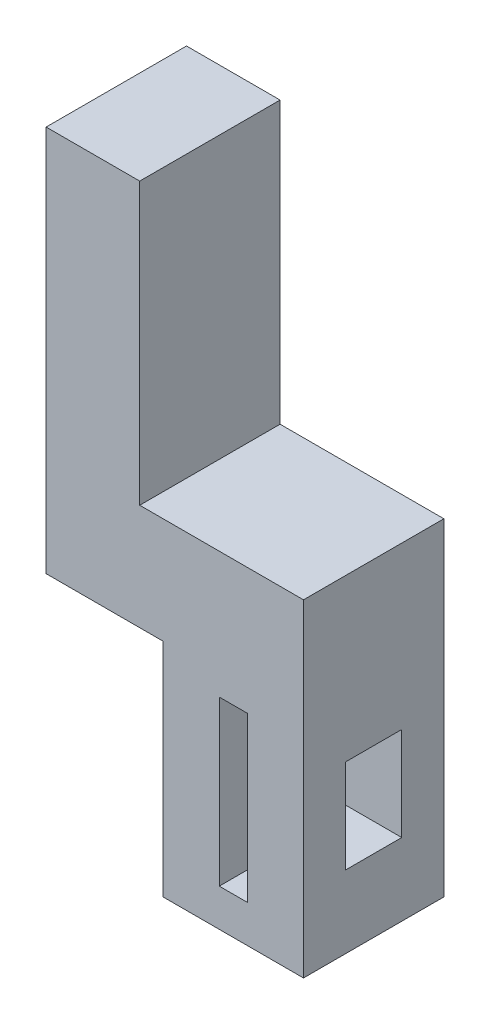
ISO-10303-21;
HEADER;
FILE_DESCRIPTION(('STEP AP214'),'2;1');
FILE_NAME('part.step','',(''),(''),'','','');
FILE_SCHEMA(('AUTOMOTIVE_DESIGN { 1 0 10303 214 1 1 1 1 }'));
ENDSEC;
DATA;
#1=APPLICATION_CONTEXT('core data for automotive mechanical design processes');
#2=APPLICATION_PROTOCOL_DEFINITION('international standard','automotive_design',2000,#1);
#3=PRODUCT_CONTEXT('',#1,'mechanical');
#4=PRODUCT('Part','Part','',(#3));
#5=PRODUCT_RELATED_PRODUCT_CATEGORY('part','',(#4));
#6=PRODUCT_DEFINITION_FORMATION('','',#4);
#7=PRODUCT_DEFINITION_CONTEXT('part definition',#1,'design');
#8=PRODUCT_DEFINITION('design','',#6,#7);
#9=PRODUCT_DEFINITION_SHAPE('','',#8);
#10=(LENGTH_UNIT() NAMED_UNIT(*) SI_UNIT(.MILLI.,.METRE.));
#11=(NAMED_UNIT(*) PLANE_ANGLE_UNIT() SI_UNIT($,.RADIAN.));
#12=(NAMED_UNIT(*) SI_UNIT($,.STERADIAN.) SOLID_ANGLE_UNIT());
#13=UNCERTAINTY_MEASURE_WITH_UNIT(LENGTH_MEASURE(1.E-05),#10,'distance_accuracy_value','');
#14=(GEOMETRIC_REPRESENTATION_CONTEXT(3) GLOBAL_UNCERTAINTY_ASSIGNED_CONTEXT((#13)) GLOBAL_UNIT_ASSIGNED_CONTEXT((#10,
#11,#12)) REPRESENTATION_CONTEXT('',''));
#15=CARTESIAN_POINT('',(0.,0.,0.));
#16=DIRECTION('',(0.,0.,1.));
#17=DIRECTION('',(1.,0.,0.));
#18=AXIS2_PLACEMENT_3D('',#15,#16,#17);
#19=CARTESIAN_POINT('',(0.,70.,0.));
#20=DIRECTION('',(1.,0.,0.));
#21=DIRECTION('',(0.,0.,-1.));
#22=AXIS2_PLACEMENT_3D('',#19,#20,#21);
#23=PLANE('',#22);
#24=DIRECTION('',(0.,0.,1.));
#25=VECTOR('',#24,1.);
#26=CARTESIAN_POINT('',(0.,35.5,21.));
#27=LINE('',#26,#25);
#28=CARTESIAN_POINT('',(0.,35.5,9.00000000000001));
#29=VERTEX_POINT('',#28);
#30=CARTESIAN_POINT('',(0.,35.5,21.));
#31=VERTEX_POINT('',#30);
#32=EDGE_CURVE('E222',#29,#31,#27,.T.);
#33=ORIENTED_EDGE('',*,*,#32,.T.);
#34=DIRECTION('',(0.,-1.,0.));
#35=VECTOR('',#34,1.);
#36=CARTESIAN_POINT('',(0.,35.5,21.));
#37=LINE('',#36,#35);
#38=CARTESIAN_POINT('',(0.,15.5,21.));
#39=VERTEX_POINT('',#38);
#40=EDGE_CURVE('E212',#31,#39,#37,.T.);
#41=ORIENTED_EDGE('',*,*,#40,.T.);
#42=DIRECTION('',(0.,0.,-1.));
#43=VECTOR('',#42,1.);
#44=CARTESIAN_POINT('',(0.,15.5,21.));
#45=LINE('',#44,#43);
#46=CARTESIAN_POINT('',(0.,15.5,9.));
#47=VERTEX_POINT('',#46);
#48=EDGE_CURVE('E215',#39,#47,#45,.T.);
#49=ORIENTED_EDGE('',*,*,#48,.T.);
#50=DIRECTION('',(0.,1.,0.));
#51=VECTOR('',#50,1.);
#52=CARTESIAN_POINT('',(0.,35.5,9.00000000000001));
#53=LINE('',#52,#51);
#54=EDGE_CURVE('E219',#47,#29,#53,.T.);
#55=ORIENTED_EDGE('',*,*,#54,.T.);
#56=EDGE_LOOP('',(#33,#41,#49,#55));
#57=FACE_BOUND('',#56,.T.);
#58=DIRECTION('',(0.,0.,1.));
#59=VECTOR('',#58,1.);
#60=CARTESIAN_POINT('',(0.,47.3303995513235,0.));
#61=LINE('',#60,#59);
#62=CARTESIAN_POINT('',(0.,47.3303995513235,0.));
#63=VERTEX_POINT('',#62);
#64=CARTESIAN_POINT('',(0.,47.3303995513235,30.));
#65=VERTEX_POINT('',#64);
#66=EDGE_CURVE('E55',#63,#65,#61,.T.);
#67=ORIENTED_EDGE('',*,*,#66,.F.);
#68=DIRECTION('',(0.,-1.,0.));
#69=VECTOR('',#68,1.);
#70=CARTESIAN_POINT('',(0.,70.,0.));
#71=LINE('',#70,#69);
#72=CARTESIAN_POINT('',(0.,0.,0.));
#73=VERTEX_POINT('',#72);
#74=EDGE_CURVE('E301',#63,#73,#71,.T.);
#75=ORIENTED_EDGE('',*,*,#74,.T.);
#76=DIRECTION('',(0.,0.,1.));
#77=VECTOR('',#76,1.);
#78=CARTESIAN_POINT('',(0.,0.,0.));
#79=LINE('',#78,#77);
#80=CARTESIAN_POINT('',(0.,0.,30.));
#81=VERTEX_POINT('',#80);
#82=EDGE_CURVE('E287',#73,#81,#79,.T.);
#83=ORIENTED_EDGE('',*,*,#82,.T.);
#84=DIRECTION('',(0.,-1.,0.));
#85=VECTOR('',#84,1.);
#86=CARTESIAN_POINT('',(0.,70.,30.));
#87=LINE('',#86,#85);
#88=EDGE_CURVE('E317',#65,#81,#87,.T.);
#89=ORIENTED_EDGE('',*,*,#88,.F.);
#90=EDGE_LOOP('',(#67,#75,#83,#89));
#91=FACE_BOUND('',#90,.T.);
#92=ADVANCED_FACE('F33',(#57,#91),#23,.F.);
#93=CARTESIAN_POINT('',(0.,70.,30.));
#94=DIRECTION('',(0.,0.,-1.));
#95=DIRECTION('',(-1.,0.,0.));
#96=AXIS2_PLACEMENT_3D('',#93,#94,#95);
#97=PLANE('',#96);
#98=DIRECTION('',(1.,0.,0.));
#99=VECTOR('',#98,1.);
#100=CARTESIAN_POINT('',(12.,8.,30.));
#101=LINE('',#100,#99);
#102=CARTESIAN_POINT('',(12.,8.,30.));
#103=VERTEX_POINT('',#102);
#104=CARTESIAN_POINT('',(18.,8.,30.));
#105=VERTEX_POINT('',#104);
#106=EDGE_CURVE('E277',#103,#105,#101,.T.);
#107=ORIENTED_EDGE('',*,*,#106,.F.);
#108=DIRECTION('',(0.,-1.,0.));
#109=VECTOR('',#108,1.);
#110=CARTESIAN_POINT('',(12.,43.,30.));
#111=LINE('',#110,#109);
#112=CARTESIAN_POINT('',(12.,43.,30.));
#113=VERTEX_POINT('',#112);
#114=EDGE_CURVE('E261',#113,#103,#111,.T.);
#115=ORIENTED_EDGE('',*,*,#114,.F.);
#116=DIRECTION('',(-1.,0.,0.));
#117=VECTOR('',#116,1.);
#118=CARTESIAN_POINT('',(12.,43.,30.));
#119=LINE('',#118,#117);
#120=CARTESIAN_POINT('',(18.,43.,30.));
#121=VERTEX_POINT('',#120);
#122=EDGE_CURVE('E266',#121,#113,#119,.T.);
#123=ORIENTED_EDGE('',*,*,#122,.F.);
#124=DIRECTION('',(0.,1.,0.));
#125=VECTOR('',#124,1.);
#126=CARTESIAN_POINT('',(18.,43.,30.));
#127=LINE('',#126,#125);
#128=EDGE_CURVE('E280',#105,#121,#127,.T.);
#129=ORIENTED_EDGE('',*,*,#128,.F.);
#130=EDGE_LOOP('',(#107,#115,#123,#129));
#131=FACE_BOUND('',#130,.T.);
#132=DIRECTION('',(1.,0.,0.));
#133=VECTOR('',#132,1.);
#134=CARTESIAN_POINT('',(0.,0.,30.));
#135=LINE('',#134,#133);
#136=CARTESIAN_POINT('',(30.,0.,30.));
#137=VERTEX_POINT('',#136);
#138=EDGE_CURVE('E304',#81,#137,#135,.T.);
#139=ORIENTED_EDGE('',*,*,#138,.T.);
#140=DIRECTION('',(0.,-1.,0.));
#141=VECTOR('',#140,1.);
#142=CARTESIAN_POINT('',(30.,70.,30.));
#143=LINE('',#142,#141);
#144=CARTESIAN_POINT('',(30.,70.,30.));
#145=VERTEX_POINT('',#144);
#146=EDGE_CURVE('E314',#145,#137,#143,.T.);
#147=ORIENTED_EDGE('',*,*,#146,.F.);
#148=DIRECTION('',(1.,0.,0.));
#149=VECTOR('',#148,1.);
#150=CARTESIAN_POINT('',(0.,70.,30.));
#151=LINE('',#150,#149);
#152=CARTESIAN_POINT('',(-5.,70.,30.));
#153=VERTEX_POINT('',#152);
#154=EDGE_CURVE('E294',#153,#145,#151,.T.);
#155=ORIENTED_EDGE('',*,*,#154,.F.);
#156=DIRECTION('',(0.,-1.,0.));
#157=VECTOR('',#156,1.);
#158=CARTESIAN_POINT('',(-5.,130.,30.));
#159=LINE('',#158,#157);
#160=CARTESIAN_POINT('',(-5.,130.,30.));
#161=VERTEX_POINT('',#160);
#162=EDGE_CURVE('E185',#161,#153,#159,.T.);
#163=ORIENTED_EDGE('',*,*,#162,.F.);
#164=DIRECTION('',(1.,0.,0.));
#165=VECTOR('',#164,1.);
#166=CARTESIAN_POINT('',(-25.,130.,30.));
#167=LINE('',#166,#165);
#168=CARTESIAN_POINT('',(-25.,130.,30.));
#169=VERTEX_POINT('',#168);
#170=EDGE_CURVE('E182',#169,#161,#167,.T.);
#171=ORIENTED_EDGE('',*,*,#170,.F.);
#172=DIRECTION('',(0.,1.,0.));
#173=VECTOR('',#172,1.);
#174=CARTESIAN_POINT('',(-25.,70.,30.));
#175=LINE('',#174,#173);
#176=CARTESIAN_POINT('',(-25.,47.3303995513235,30.));
#177=VERTEX_POINT('',#176);
#178=EDGE_CURVE('E169',#177,#169,#175,.T.);
#179=ORIENTED_EDGE('',*,*,#178,.F.);
#180=DIRECTION('',(1.,0.,0.));
#181=VECTOR('',#180,1.);
#182=CARTESIAN_POINT('',(-25.,47.3303995513235,30.));
#183=LINE('',#182,#181);
#184=EDGE_CURVE('E179',#177,#65,#183,.T.);
#185=ORIENTED_EDGE('',*,*,#184,.T.);
#186=ORIENTED_EDGE('',*,*,#88,.T.);
#187=EDGE_LOOP('',(#139,#147,#155,#163,#171,#179,#185,#186));
#188=FACE_BOUND('',#187,.T.);
#189=ADVANCED_FACE('F183',(#131,#188),#97,.F.);
#190=CARTESIAN_POINT('',(30.,70.,0.));
#191=DIRECTION('',(-1.,0.,0.));
#192=DIRECTION('',(0.,0.,1.));
#193=AXIS2_PLACEMENT_3D('',#190,#191,#192);
#194=PLANE('',#193);
#195=DIRECTION('',(0.,0.,-1.));
#196=VECTOR('',#195,1.);
#197=CARTESIAN_POINT('',(30.,15.5,21.));
#198=LINE('',#197,#196);
#199=CARTESIAN_POINT('',(30.,15.5,21.));
#200=VERTEX_POINT('',#199);
#201=CARTESIAN_POINT('',(30.,15.5,9.));
#202=VERTEX_POINT('',#201);
#203=EDGE_CURVE('E227',#200,#202,#198,.T.);
#204=ORIENTED_EDGE('',*,*,#203,.F.);
#205=DIRECTION('',(0.,-1.,0.));
#206=VECTOR('',#205,1.);
#207=CARTESIAN_POINT('',(30.,35.5,21.));
#208=LINE('',#207,#206);
#209=CARTESIAN_POINT('',(30.,35.5,21.));
#210=VERTEX_POINT('',#209);
#211=EDGE_CURVE('E211',#210,#200,#208,.T.);
#212=ORIENTED_EDGE('',*,*,#211,.F.);
#213=DIRECTION('',(0.,0.,1.));
#214=VECTOR('',#213,1.);
#215=CARTESIAN_POINT('',(30.,35.5,21.));
#216=LINE('',#215,#214);
#217=CARTESIAN_POINT('',(30.,35.5,9.));
#218=VERTEX_POINT('',#217);
#219=EDGE_CURVE('E216',#218,#210,#216,.T.);
#220=ORIENTED_EDGE('',*,*,#219,.F.);
#221=DIRECTION('',(0.,1.,0.));
#222=VECTOR('',#221,1.);
#223=CARTESIAN_POINT('',(30.,35.5,9.));
#224=LINE('',#223,#222);
#225=EDGE_CURVE('E230',#202,#218,#224,.T.);
#226=ORIENTED_EDGE('',*,*,#225,.F.);
#227=EDGE_LOOP('',(#204,#212,#220,#226));
#228=FACE_BOUND('',#227,.T.);
#229=DIRECTION('',(0.,0.,-1.));
#230=VECTOR('',#229,1.);
#231=CARTESIAN_POINT('',(30.,0.,0.));
#232=LINE('',#231,#230);
#233=CARTESIAN_POINT('',(30.,0.,0.));
#234=VERTEX_POINT('',#233);
#235=EDGE_CURVE('E306',#137,#234,#232,.T.);
#236=ORIENTED_EDGE('',*,*,#235,.T.);
#237=DIRECTION('',(0.,-1.,0.));
#238=VECTOR('',#237,1.);
#239=CARTESIAN_POINT('',(30.,70.,0.));
#240=LINE('',#239,#238);
#241=CARTESIAN_POINT('',(30.,70.,0.));
#242=VERTEX_POINT('',#241);
#243=EDGE_CURVE('E311',#242,#234,#240,.T.);
#244=ORIENTED_EDGE('',*,*,#243,.F.);
#245=DIRECTION('',(0.,0.,-1.));
#246=VECTOR('',#245,1.);
#247=CARTESIAN_POINT('',(30.,70.,0.));
#248=LINE('',#247,#246);
#249=EDGE_CURVE('E296',#145,#242,#248,.T.);
#250=ORIENTED_EDGE('',*,*,#249,.F.);
#251=ORIENTED_EDGE('',*,*,#146,.T.);
#252=EDGE_LOOP('',(#236,#244,#250,#251));
#253=FACE_BOUND('',#252,.T.);
#254=ADVANCED_FACE('F340',(#228,#253),#194,.F.);
#255=CARTESIAN_POINT('',(0.,70.,0.));
#256=DIRECTION('',(0.,0.,1.));
#257=DIRECTION('',(1.,0.,0.));
#258=AXIS2_PLACEMENT_3D('',#255,#256,#257);
#259=PLANE('',#258);
#260=DIRECTION('',(-1.,0.,0.));
#261=VECTOR('',#260,1.);
#262=CARTESIAN_POINT('',(12.,43.,0.));
#263=LINE('',#262,#261);
#264=CARTESIAN_POINT('',(18.,43.,0.));
#265=VERTEX_POINT('',#264);
#266=CARTESIAN_POINT('',(12.,43.,0.));
#267=VERTEX_POINT('',#266);
#268=EDGE_CURVE('E272',#265,#267,#263,.T.);
#269=ORIENTED_EDGE('',*,*,#268,.T.);
#270=DIRECTION('',(0.,-1.,0.));
#271=VECTOR('',#270,1.);
#272=CARTESIAN_POINT('',(12.,43.,0.));
#273=LINE('',#272,#271);
#274=CARTESIAN_POINT('',(12.,8.,0.));
#275=VERTEX_POINT('',#274);
#276=EDGE_CURVE('E262',#267,#275,#273,.T.);
#277=ORIENTED_EDGE('',*,*,#276,.T.);
#278=DIRECTION('',(1.,0.,0.));
#279=VECTOR('',#278,1.);
#280=CARTESIAN_POINT('',(12.,8.,0.));
#281=LINE('',#280,#279);
#282=CARTESIAN_POINT('',(18.,8.,0.));
#283=VERTEX_POINT('',#282);
#284=EDGE_CURVE('E265',#275,#283,#281,.T.);
#285=ORIENTED_EDGE('',*,*,#284,.T.);
#286=DIRECTION('',(0.,1.,0.));
#287=VECTOR('',#286,1.);
#288=CARTESIAN_POINT('',(18.,43.,0.));
#289=LINE('',#288,#287);
#290=EDGE_CURVE('E269',#283,#265,#289,.T.);
#291=ORIENTED_EDGE('',*,*,#290,.T.);
#292=EDGE_LOOP('',(#269,#277,#285,#291));
#293=FACE_BOUND('',#292,.T.);
#294=DIRECTION('',(-1.,0.,0.));
#295=VECTOR('',#294,1.);
#296=CARTESIAN_POINT('',(0.,0.,0.));
#297=LINE('',#296,#295);
#298=EDGE_CURVE('E297',#234,#73,#297,.T.);
#299=ORIENTED_EDGE('',*,*,#298,.T.);
#300=ORIENTED_EDGE('',*,*,#74,.F.);
#301=DIRECTION('',(1.,0.,0.));
#302=VECTOR('',#301,1.);
#303=CARTESIAN_POINT('',(-25.,47.3303995513235,0.));
#304=LINE('',#303,#302);
#305=CARTESIAN_POINT('',(-25.,47.3303995513235,0.));
#306=VERTEX_POINT('',#305);
#307=EDGE_CURVE('E208',#306,#63,#304,.T.);
#308=ORIENTED_EDGE('',*,*,#307,.F.);
#309=DIRECTION('',(0.,-1.,0.));
#310=VECTOR('',#309,1.);
#311=CARTESIAN_POINT('',(-25.,70.,0.));
#312=LINE('',#311,#310);
#313=CARTESIAN_POINT('',(-25.,130.,0.));
#314=VERTEX_POINT('',#313);
#315=EDGE_CURVE('E203',#314,#306,#312,.T.);
#316=ORIENTED_EDGE('',*,*,#315,.F.);
#317=DIRECTION('',(-1.,0.,0.));
#318=VECTOR('',#317,1.);
#319=CARTESIAN_POINT('',(-25.,130.,0.));
#320=LINE('',#319,#318);
#321=CARTESIAN_POINT('',(-5.,130.,0.));
#322=VERTEX_POINT('',#321);
#323=EDGE_CURVE('E193',#322,#314,#320,.T.);
#324=ORIENTED_EDGE('',*,*,#323,.F.);
#325=DIRECTION('',(0.,-1.,0.));
#326=VECTOR('',#325,1.);
#327=CARTESIAN_POINT('',(-5.,130.,0.));
#328=LINE('',#327,#326);
#329=CARTESIAN_POINT('',(-5.,70.,0.));
#330=VERTEX_POINT('',#329);
#331=EDGE_CURVE('E198',#322,#330,#328,.T.);
#332=ORIENTED_EDGE('',*,*,#331,.T.);
#333=DIRECTION('',(-1.,0.,0.));
#334=VECTOR('',#333,1.);
#335=CARTESIAN_POINT('',(0.,70.,0.));
#336=LINE('',#335,#334);
#337=EDGE_CURVE('E299',#242,#330,#336,.T.);
#338=ORIENTED_EDGE('',*,*,#337,.F.);
#339=ORIENTED_EDGE('',*,*,#243,.T.);
#340=EDGE_LOOP('',(#299,#300,#308,#316,#324,#332,#338,#339));
#341=FACE_BOUND('',#340,.T.);
#342=ADVANCED_FACE('F396',(#293,#341),#259,.F.);
#343=CARTESIAN_POINT('',(0.,70.,0.));
#344=DIRECTION('',(0.,1.,0.));
#345=DIRECTION('',(0.,0.,1.));
#346=AXIS2_PLACEMENT_3D('',#343,#344,#345);
#347=PLANE('',#346);
#348=DIRECTION('',(0.,0.,-1.));
#349=VECTOR('',#348,1.);
#350=CARTESIAN_POINT('',(-5.,70.,30.));
#351=LINE('',#350,#349);
#352=EDGE_CURVE('E47',#153,#330,#351,.T.);
#353=ORIENTED_EDGE('',*,*,#352,.F.);
#354=ORIENTED_EDGE('',*,*,#154,.T.);
#355=ORIENTED_EDGE('',*,*,#249,.T.);
#356=ORIENTED_EDGE('',*,*,#337,.T.);
#357=EDGE_LOOP('',(#353,#354,#355,#356));
#358=FACE_BOUND('',#357,.T.);
#359=ADVANCED_FACE('F406',(#358),#347,.T.);
#360=CARTESIAN_POINT('',(0.,0.,0.));
#361=DIRECTION('',(0.,1.,0.));
#362=DIRECTION('',(0.,0.,1.));
#363=AXIS2_PLACEMENT_3D('',#360,#361,#362);
#364=PLANE('',#363);
#365=ORIENTED_EDGE('',*,*,#82,.F.);
#366=ORIENTED_EDGE('',*,*,#298,.F.);
#367=ORIENTED_EDGE('',*,*,#235,.F.);
#368=ORIENTED_EDGE('',*,*,#138,.F.);
#369=EDGE_LOOP('',(#365,#366,#367,#368));
#370=FACE_BOUND('',#369,.T.);
#371=ADVANCED_FACE('F385',(#370),#364,.F.);
#372=CARTESIAN_POINT('',(12.,43.,0.));
#373=DIRECTION('',(-1.,0.,0.));
#374=DIRECTION('',(0.,-1.,0.));
#375=AXIS2_PLACEMENT_3D('',#372,#373,#374);
#376=PLANE('',#375);
#377=DIRECTION('',(0.,0.,1.));
#378=VECTOR('',#377,1.);
#379=CARTESIAN_POINT('',(12.,15.5,0.));
#380=LINE('',#379,#378);
#381=CARTESIAN_POINT('',(12.,15.5,9.));
#382=VERTEX_POINT('',#381);
#383=CARTESIAN_POINT('',(12.,15.5,21.));
#384=VERTEX_POINT('',#383);
#385=EDGE_CURVE('E238',#382,#384,#380,.T.);
#386=ORIENTED_EDGE('',*,*,#385,.T.);
#387=DIRECTION('',(0.,1.,0.));
#388=VECTOR('',#387,1.);
#389=CARTESIAN_POINT('',(12.,43.,21.));
#390=LINE('',#389,#388);
#391=CARTESIAN_POINT('',(12.,35.5,21.));
#392=VERTEX_POINT('',#391);
#393=EDGE_CURVE('E258',#384,#392,#390,.T.);
#394=ORIENTED_EDGE('',*,*,#393,.T.);
#395=DIRECTION('',(0.,0.,-1.));
#396=VECTOR('',#395,1.);
#397=CARTESIAN_POINT('',(12.,35.5,0.));
#398=LINE('',#397,#396);
#399=CARTESIAN_POINT('',(12.,35.5,9.));
#400=VERTEX_POINT('',#399);
#401=EDGE_CURVE('E255',#392,#400,#398,.T.);
#402=ORIENTED_EDGE('',*,*,#401,.T.);
#403=DIRECTION('',(0.,-1.,0.));
#404=VECTOR('',#403,1.);
#405=CARTESIAN_POINT('',(12.,43.,9.));
#406=LINE('',#405,#404);
#407=EDGE_CURVE('E252',#400,#382,#406,.T.);
#408=ORIENTED_EDGE('',*,*,#407,.T.);
#409=EDGE_LOOP('',(#386,#394,#402,#408));
#410=FACE_BOUND('',#409,.T.);
#411=ORIENTED_EDGE('',*,*,#114,.T.);
#412=DIRECTION('',(0.,0.,1.));
#413=VECTOR('',#412,1.);
#414=CARTESIAN_POINT('',(12.,8.,0.));
#415=LINE('',#414,#413);
#416=EDGE_CURVE('E275',#275,#103,#415,.T.);
#417=ORIENTED_EDGE('',*,*,#416,.F.);
#418=ORIENTED_EDGE('',*,*,#276,.F.);
#419=DIRECTION('',(0.,0.,1.));
#420=VECTOR('',#419,1.);
#421=CARTESIAN_POINT('',(12.,43.,0.));
#422=LINE('',#421,#420);
#423=EDGE_CURVE('E285',#267,#113,#422,.T.);
#424=ORIENTED_EDGE('',*,*,#423,.T.);
#425=EDGE_LOOP('',(#411,#417,#418,#424));
#426=FACE_BOUND('',#425,.T.);
#427=ADVANCED_FACE('F381',(#410,#426),#376,.F.);
#428=CARTESIAN_POINT('',(12.,43.,0.));
#429=DIRECTION('',(0.,1.,0.));
#430=DIRECTION('',(0.,0.,1.));
#431=AXIS2_PLACEMENT_3D('',#428,#429,#430);
#432=PLANE('',#431);
#433=ORIENTED_EDGE('',*,*,#122,.T.);
#434=ORIENTED_EDGE('',*,*,#423,.F.);
#435=ORIENTED_EDGE('',*,*,#268,.F.);
#436=DIRECTION('',(0.,0.,1.));
#437=VECTOR('',#436,1.);
#438=CARTESIAN_POINT('',(18.,43.,0.));
#439=LINE('',#438,#437);
#440=EDGE_CURVE('E288',#265,#121,#439,.T.);
#441=ORIENTED_EDGE('',*,*,#440,.T.);
#442=EDGE_LOOP('',(#433,#434,#435,#441));
#443=FACE_BOUND('',#442,.T.);
#444=ADVANCED_FACE('F384',(#443),#432,.F.);
#445=CARTESIAN_POINT('',(18.,43.,0.));
#446=DIRECTION('',(1.,0.,0.));
#447=DIRECTION('',(0.,1.,0.));
#448=AXIS2_PLACEMENT_3D('',#445,#446,#447);
#449=PLANE('',#448);
#450=DIRECTION('',(0.,0.,1.));
#451=VECTOR('',#450,1.);
#452=CARTESIAN_POINT('',(18.,35.5,0.));
#453=LINE('',#452,#451);
#454=CARTESIAN_POINT('',(18.,35.5,9.));
#455=VERTEX_POINT('',#454);
#456=CARTESIAN_POINT('',(18.,35.5,21.));
#457=VERTEX_POINT('',#456);
#458=EDGE_CURVE('E40',#455,#457,#453,.T.);
#459=ORIENTED_EDGE('',*,*,#458,.T.);
#460=DIRECTION('',(0.,-1.,0.));
#461=VECTOR('',#460,1.);
#462=CARTESIAN_POINT('',(18.,43.,21.));
#463=LINE('',#462,#461);
#464=CARTESIAN_POINT('',(18.,15.5,21.));
#465=VERTEX_POINT('',#464);
#466=EDGE_CURVE('E11',#457,#465,#463,.T.);
#467=ORIENTED_EDGE('',*,*,#466,.T.);
#468=DIRECTION('',(0.,0.,-1.));
#469=VECTOR('',#468,1.);
#470=CARTESIAN_POINT('',(18.,15.5,0.));
#471=LINE('',#470,#469);
#472=CARTESIAN_POINT('',(18.,15.5,9.));
#473=VERTEX_POINT('',#472);
#474=EDGE_CURVE('E319',#465,#473,#471,.T.);
#475=ORIENTED_EDGE('',*,*,#474,.T.);
#476=DIRECTION('',(0.,1.,0.));
#477=VECTOR('',#476,1.);
#478=CARTESIAN_POINT('',(18.,43.,9.));
#479=LINE('',#478,#477);
#480=EDGE_CURVE('E322',#473,#455,#479,.T.);
#481=ORIENTED_EDGE('',*,*,#480,.T.);
#482=EDGE_LOOP('',(#459,#467,#475,#481));
#483=FACE_BOUND('',#482,.T.);
#484=ORIENTED_EDGE('',*,*,#128,.T.);
#485=ORIENTED_EDGE('',*,*,#440,.F.);
#486=ORIENTED_EDGE('',*,*,#290,.F.);
#487=DIRECTION('',(0.,0.,1.));
#488=VECTOR('',#487,1.);
#489=CARTESIAN_POINT('',(18.,8.,0.));
#490=LINE('',#489,#488);
#491=EDGE_CURVE('E290',#283,#105,#490,.T.);
#492=ORIENTED_EDGE('',*,*,#491,.T.);
#493=EDGE_LOOP('',(#484,#485,#486,#492));
#494=FACE_BOUND('',#493,.T.);
#495=ADVANCED_FACE('F326',(#483,#494),#449,.F.);
#496=CARTESIAN_POINT('',(12.,8.,0.));
#497=DIRECTION('',(0.,-1.,0.));
#498=DIRECTION('',(0.,0.,-1.));
#499=AXIS2_PLACEMENT_3D('',#496,#497,#498);
#500=PLANE('',#499);
#501=ORIENTED_EDGE('',*,*,#106,.T.);
#502=ORIENTED_EDGE('',*,*,#491,.F.);
#503=ORIENTED_EDGE('',*,*,#284,.F.);
#504=ORIENTED_EDGE('',*,*,#416,.T.);
#505=EDGE_LOOP('',(#501,#502,#503,#504));
#506=FACE_BOUND('',#505,.T.);
#507=ADVANCED_FACE('F349',(#506),#500,.F.);
#508=CARTESIAN_POINT('',(0.,15.5,21.));
#509=DIRECTION('',(0.,-1.,0.));
#510=DIRECTION('',(0.,0.,-1.));
#511=AXIS2_PLACEMENT_3D('',#508,#509,#510);
#512=PLANE('',#511);
#513=DIRECTION('',(1.,0.,0.));
#514=VECTOR('',#513,1.);
#515=CARTESIAN_POINT('',(0.,15.5,21.));
#516=LINE('',#515,#514);
#517=EDGE_CURVE('E225',#465,#200,#516,.T.);
#518=ORIENTED_EDGE('',*,*,#517,.T.);
#519=ORIENTED_EDGE('',*,*,#203,.T.);
#520=DIRECTION('',(1.,0.,0.));
#521=VECTOR('',#520,1.);
#522=CARTESIAN_POINT('',(0.,15.5,9.00000000000001));
#523=LINE('',#522,#521);
#524=EDGE_CURVE('E247',#473,#202,#523,.T.);
#525=ORIENTED_EDGE('',*,*,#524,.F.);
#526=ORIENTED_EDGE('',*,*,#474,.F.);
#527=EDGE_LOOP('',(#518,#519,#525,#526));
#528=FACE_BOUND('',#527,.T.);
#529=ADVANCED_FACE('F347',(#528),#512,.F.);
#530=CARTESIAN_POINT('',(0.,35.5,9.00000000000001));
#531=DIRECTION('',(0.,0.,-1.));
#532=DIRECTION('',(-1.,0.,0.));
#533=AXIS2_PLACEMENT_3D('',#530,#531,#532);
#534=PLANE('',#533);
#535=ORIENTED_EDGE('',*,*,#524,.T.);
#536=ORIENTED_EDGE('',*,*,#225,.T.);
#537=DIRECTION('',(1.,0.,0.));
#538=VECTOR('',#537,1.);
#539=CARTESIAN_POINT('',(0.,35.5,9.00000000000001));
#540=LINE('',#539,#538);
#541=EDGE_CURVE('E243',#455,#218,#540,.T.);
#542=ORIENTED_EDGE('',*,*,#541,.F.);
#543=ORIENTED_EDGE('',*,*,#480,.F.);
#544=EDGE_LOOP('',(#535,#536,#542,#543));
#545=FACE_BOUND('',#544,.T.);
#546=ADVANCED_FACE('F334',(#545),#534,.F.);
#547=CARTESIAN_POINT('',(0.,35.5,21.));
#548=DIRECTION('',(0.,1.,0.));
#549=DIRECTION('',(0.,0.,1.));
#550=AXIS2_PLACEMENT_3D('',#547,#548,#549);
#551=PLANE('',#550);
#552=ORIENTED_EDGE('',*,*,#541,.T.);
#553=ORIENTED_EDGE('',*,*,#219,.T.);
#554=DIRECTION('',(1.,0.,0.));
#555=VECTOR('',#554,1.);
#556=CARTESIAN_POINT('',(0.,35.5,21.));
#557=LINE('',#556,#555);
#558=EDGE_CURVE('E239',#457,#210,#557,.T.);
#559=ORIENTED_EDGE('',*,*,#558,.F.);
#560=ORIENTED_EDGE('',*,*,#458,.F.);
#561=EDGE_LOOP('',(#552,#553,#559,#560));
#562=FACE_BOUND('',#561,.T.);
#563=ADVANCED_FACE('F332',(#562),#551,.F.);
#564=CARTESIAN_POINT('',(0.,35.5,21.));
#565=DIRECTION('',(0.,0.,1.));
#566=DIRECTION('',(0.,-1.,0.));
#567=AXIS2_PLACEMENT_3D('',#564,#565,#566);
#568=PLANE('',#567);
#569=ORIENTED_EDGE('',*,*,#558,.T.);
#570=ORIENTED_EDGE('',*,*,#211,.T.);
#571=ORIENTED_EDGE('',*,*,#517,.F.);
#572=ORIENTED_EDGE('',*,*,#466,.F.);
#573=EDGE_LOOP('',(#569,#570,#571,#572));
#574=FACE_BOUND('',#573,.T.);
#575=ADVANCED_FACE('F345',(#574),#568,.F.);
#576=EDGE_CURVE('E248',#39,#384,#516,.T.);
#577=ORIENTED_EDGE('',*,*,#576,.F.);
#578=ORIENTED_EDGE('',*,*,#40,.F.);
#579=EDGE_CURVE('E235',#31,#392,#557,.T.);
#580=ORIENTED_EDGE('',*,*,#579,.T.);
#581=ORIENTED_EDGE('',*,*,#393,.F.);
#582=EDGE_LOOP('',(#577,#578,#580,#581));
#583=FACE_BOUND('',#582,.T.);
#584=ADVANCED_FACE('F376',(#583),#568,.F.);
#585=ORIENTED_EDGE('',*,*,#579,.F.);
#586=ORIENTED_EDGE('',*,*,#32,.F.);
#587=EDGE_CURVE('E240',#29,#400,#540,.T.);
#588=ORIENTED_EDGE('',*,*,#587,.T.);
#589=ORIENTED_EDGE('',*,*,#401,.F.);
#590=EDGE_LOOP('',(#585,#586,#588,#589));
#591=FACE_BOUND('',#590,.T.);
#592=ADVANCED_FACE('F373',(#591),#551,.F.);
#593=ORIENTED_EDGE('',*,*,#587,.F.);
#594=ORIENTED_EDGE('',*,*,#54,.F.);
#595=EDGE_CURVE('E244',#47,#382,#523,.T.);
#596=ORIENTED_EDGE('',*,*,#595,.T.);
#597=ORIENTED_EDGE('',*,*,#407,.F.);
#598=EDGE_LOOP('',(#593,#594,#596,#597));
#599=FACE_BOUND('',#598,.T.);
#600=ADVANCED_FACE('F357',(#599),#534,.F.);
#601=ORIENTED_EDGE('',*,*,#595,.F.);
#602=ORIENTED_EDGE('',*,*,#48,.F.);
#603=ORIENTED_EDGE('',*,*,#576,.T.);
#604=ORIENTED_EDGE('',*,*,#385,.F.);
#605=EDGE_LOOP('',(#601,#602,#603,#604));
#606=FACE_BOUND('',#605,.T.);
#607=ADVANCED_FACE('F351',(#606),#512,.F.);
#608=CARTESIAN_POINT('',(-25.,47.3303995513235,0.));
#609=DIRECTION('',(0.,1.,0.));
#610=DIRECTION('',(0.,0.,1.));
#611=AXIS2_PLACEMENT_3D('',#608,#609,#610);
#612=PLANE('',#611);
#613=ORIENTED_EDGE('',*,*,#66,.T.);
#614=ORIENTED_EDGE('',*,*,#184,.F.);
#615=DIRECTION('',(0.,0.,1.));
#616=VECTOR('',#615,1.);
#617=CARTESIAN_POINT('',(-25.,47.3303995513235,0.));
#618=LINE('',#617,#616);
#619=EDGE_CURVE('E175',#306,#177,#618,.T.);
#620=ORIENTED_EDGE('',*,*,#619,.F.);
#621=ORIENTED_EDGE('',*,*,#307,.T.);
#622=EDGE_LOOP('',(#613,#614,#620,#621));
#623=FACE_BOUND('',#622,.T.);
#624=ADVANCED_FACE('F362',(#623),#612,.F.);
#625=CARTESIAN_POINT('',(-25.,0.,0.));
#626=DIRECTION('',(-1.,0.,0.));
#627=DIRECTION('',(0.,0.,1.));
#628=AXIS2_PLACEMENT_3D('',#625,#626,#627);
#629=PLANE('',#628);
#630=ORIENTED_EDGE('',*,*,#315,.T.);
#631=ORIENTED_EDGE('',*,*,#619,.T.);
#632=ORIENTED_EDGE('',*,*,#178,.T.);
#633=DIRECTION('',(0.,0.,1.));
#634=VECTOR('',#633,1.);
#635=CARTESIAN_POINT('',(-25.,130.,30.));
#636=LINE('',#635,#634);
#637=EDGE_CURVE('E174',#314,#169,#636,.T.);
#638=ORIENTED_EDGE('',*,*,#637,.F.);
#639=EDGE_LOOP('',(#630,#631,#632,#638));
#640=FACE_BOUND('',#639,.T.);
#641=ADVANCED_FACE('F172',(#640),#629,.T.);
#642=CARTESIAN_POINT('',(-5.,130.,30.));
#643=DIRECTION('',(-1.,0.,0.));
#644=DIRECTION('',(0.,0.,1.));
#645=AXIS2_PLACEMENT_3D('',#642,#643,#644);
#646=PLANE('',#645);
#647=ORIENTED_EDGE('',*,*,#352,.T.);
#648=ORIENTED_EDGE('',*,*,#331,.F.);
#649=DIRECTION('',(0.,0.,-1.));
#650=VECTOR('',#649,1.);
#651=CARTESIAN_POINT('',(-5.,130.,30.));
#652=LINE('',#651,#650);
#653=EDGE_CURVE('E188',#161,#322,#652,.T.);
#654=ORIENTED_EDGE('',*,*,#653,.F.);
#655=ORIENTED_EDGE('',*,*,#162,.T.);
#656=EDGE_LOOP('',(#647,#648,#654,#655));
#657=FACE_BOUND('',#656,.T.);
#658=ADVANCED_FACE('F536',(#657),#646,.F.);
#659=CARTESIAN_POINT('',(0.,130.,0.));
#660=DIRECTION('',(0.,-1.,0.));
#661=DIRECTION('',(0.,0.,-1.));
#662=AXIS2_PLACEMENT_3D('',#659,#660,#661);
#663=PLANE('',#662);
#664=ORIENTED_EDGE('',*,*,#637,.T.);
#665=ORIENTED_EDGE('',*,*,#170,.T.);
#666=ORIENTED_EDGE('',*,*,#653,.T.);
#667=ORIENTED_EDGE('',*,*,#323,.T.);
#668=EDGE_LOOP('',(#664,#665,#666,#667));
#669=FACE_BOUND('',#668,.T.);
#670=ADVANCED_FACE('F191',(#669),#663,.F.);
#671=CLOSED_SHELL('',(#92,#189,#254,#342,#359,#371,#427,#444,#495,#507,#529,#546,#563,#575,#584,
#592,#600,#607,#624,#641,#658,#670));
#672=MANIFOLD_SOLID_BREP('B2',#671);
#673=ADVANCED_BREP_SHAPE_REPRESENTATION('',(#18,#672),#14);
#674=SHAPE_DEFINITION_REPRESENTATION(#9,#673);
ENDSEC;
END-ISO-10303-21;
